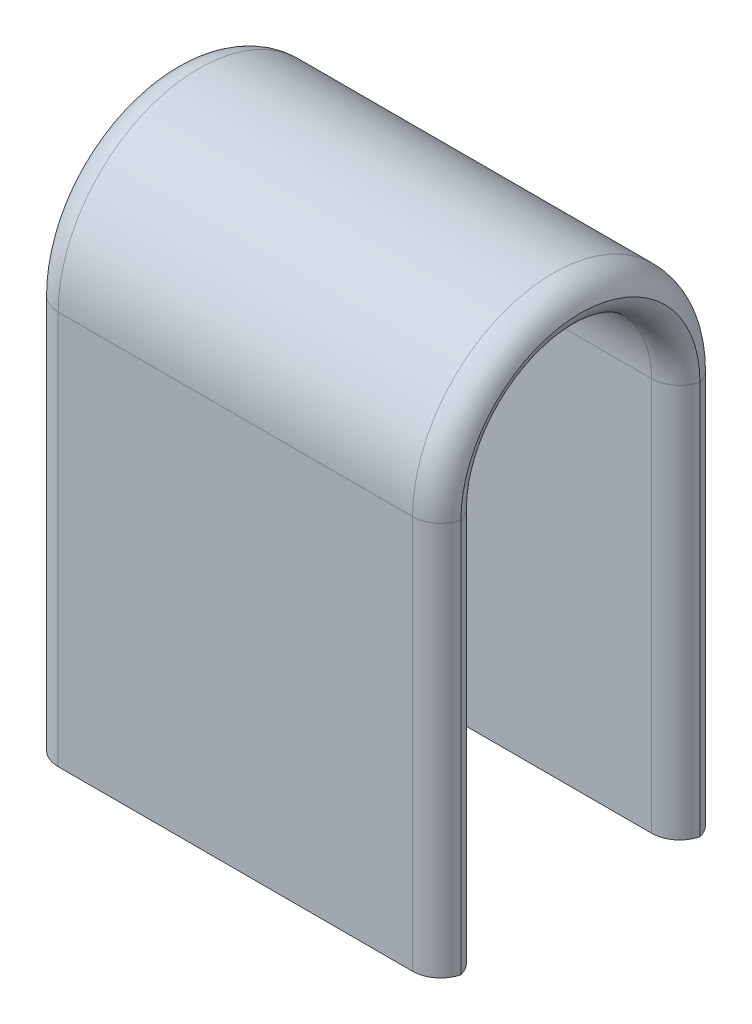
ISO-10303-21;
HEADER;
FILE_DESCRIPTION(('STEP AP214'),'2;1');
FILE_NAME('part.step','',(''),(''),'','','');
FILE_SCHEMA(('AUTOMOTIVE_DESIGN { 1 0 10303 214 1 1 1 1 }'));
ENDSEC;
DATA;
#1=APPLICATION_CONTEXT('core data for automotive mechanical design processes');
#2=APPLICATION_PROTOCOL_DEFINITION('international standard','automotive_design',2000,#1);
#3=PRODUCT_CONTEXT('',#1,'mechanical');
#4=PRODUCT('Part','Part','',(#3));
#5=PRODUCT_RELATED_PRODUCT_CATEGORY('part','',(#4));
#6=PRODUCT_DEFINITION_FORMATION('','',#4);
#7=PRODUCT_DEFINITION_CONTEXT('part definition',#1,'design');
#8=PRODUCT_DEFINITION('design','',#6,#7);
#9=PRODUCT_DEFINITION_SHAPE('','',#8);
#10=(LENGTH_UNIT() NAMED_UNIT(*) SI_UNIT(.MILLI.,.METRE.));
#11=(NAMED_UNIT(*) PLANE_ANGLE_UNIT() SI_UNIT($,.RADIAN.));
#12=(NAMED_UNIT(*) SI_UNIT($,.STERADIAN.) SOLID_ANGLE_UNIT());
#13=UNCERTAINTY_MEASURE_WITH_UNIT(LENGTH_MEASURE(1.E-05),#10,'distance_accuracy_value','');
#14=(GEOMETRIC_REPRESENTATION_CONTEXT(3) GLOBAL_UNCERTAINTY_ASSIGNED_CONTEXT((#13)) GLOBAL_UNIT_ASSIGNED_CONTEXT((#10,
#11,#12)) REPRESENTATION_CONTEXT('',''));
#15=CARTESIAN_POINT('',(0.,0.,0.));
#16=DIRECTION('',(0.,0.,1.));
#17=DIRECTION('',(1.,0.,0.));
#18=AXIS2_PLACEMENT_3D('',#15,#16,#17);
#19=CARTESIAN_POINT('',(-9.271,-8.89,-1.905));
#20=DIRECTION('',(0.,-1.,0.));
#21=DIRECTION('',(0.,0.,-1.));
#22=AXIS2_PLACEMENT_3D('',#19,#20,#21);
#23=PLANE('',#22);
#24=CARTESIAN_POINT('',(-8.001,-8.89,-1.27));
#25=DIRECTION('',(0.,-1.,0.));
#26=DIRECTION('',(0.,0.,-1.));
#27=AXIS2_PLACEMENT_3D('',#24,#25,#26);
#28=CIRCLE('',#27,1.27);
#29=CARTESIAN_POINT('',(-8.001,-8.89,0.));
#30=VERTEX_POINT('',#29);
#31=CARTESIAN_POINT('',(-9.23067221242085,-8.89,-0.9525));
#32=VERTEX_POINT('',#31);
#33=EDGE_CURVE('E52',#30,#32,#28,.T.);
#34=ORIENTED_EDGE('',*,*,#33,.T.);
#35=CARTESIAN_POINT('',(-8.001,-8.89,-0.635));
#36=DIRECTION('',(0.,-1.,0.));
#37=DIRECTION('',(0.,0.,-1.));
#38=AXIS2_PLACEMENT_3D('',#35,#36,#37);
#39=CIRCLE('',#38,1.27);
#40=CARTESIAN_POINT('',(-8.001,-8.89,-1.905));
#41=VERTEX_POINT('',#40);
#42=EDGE_CURVE('E165',#32,#41,#39,.T.);
#43=ORIENTED_EDGE('',*,*,#42,.T.);
#44=DIRECTION('',(1.,0.,0.));
#45=VECTOR('',#44,1.);
#46=CARTESIAN_POINT('',(-9.271,-8.89,-1.905));
#47=LINE('',#46,#45);
#48=CARTESIAN_POINT('',(8.001,-8.89,-1.905));
#49=VERTEX_POINT('',#48);
#50=EDGE_CURVE('E160',#41,#49,#47,.T.);
#51=ORIENTED_EDGE('',*,*,#50,.T.);
#52=CARTESIAN_POINT('',(8.001,-8.89,-0.635));
#53=DIRECTION('',(0.,-1.,0.));
#54=DIRECTION('',(0.,0.,-1.));
#55=AXIS2_PLACEMENT_3D('',#52,#53,#54);
#56=CIRCLE('',#55,1.27);
#57=CARTESIAN_POINT('',(9.23067221242086,-8.89,-0.9525));
#58=VERTEX_POINT('',#57);
#59=EDGE_CURVE('E167',#49,#58,#56,.T.);
#60=ORIENTED_EDGE('',*,*,#59,.T.);
#61=CARTESIAN_POINT('',(8.001,-8.89,-1.27));
#62=DIRECTION('',(0.,-1.,0.));
#63=DIRECTION('',(0.,0.,-1.));
#64=AXIS2_PLACEMENT_3D('',#61,#62,#63);
#65=CIRCLE('',#64,1.27);
#66=CARTESIAN_POINT('',(8.001,-8.89,0.));
#67=VERTEX_POINT('',#66);
#68=EDGE_CURVE('E84',#58,#67,#65,.T.);
#69=ORIENTED_EDGE('',*,*,#68,.T.);
#70=DIRECTION('',(1.,0.,0.));
#71=VECTOR('',#70,1.);
#72=CARTESIAN_POINT('',(-9.271,-8.89,0.));
#73=LINE('',#72,#71);
#74=EDGE_CURVE('E220',#30,#67,#73,.T.);
#75=ORIENTED_EDGE('',*,*,#74,.F.);
#76=EDGE_LOOP('',(#34,#43,#51,#60,#69,#75));
#77=FACE_BOUND('',#76,.T.);
#78=ADVANCED_FACE('F33',(#77),#23,.T.);
#79=CARTESIAN_POINT('',(0.,0.,-1.905));
#80=DIRECTION('',(0.,0.,-1.));
#81=DIRECTION('',(-1.,0.,0.));
#82=AXIS2_PLACEMENT_3D('',#79,#80,#81);
#83=PLANE('',#82);
#84=ORIENTED_EDGE('',*,*,#50,.F.);
#85=DIRECTION('',(0.,-1.,0.));
#86=VECTOR('',#85,1.);
#87=CARTESIAN_POINT('',(-8.001,0.,-1.905));
#88=LINE('',#87,#86);
#89=CARTESIAN_POINT('',(-8.001,8.89,-1.905));
#90=VERTEX_POINT('',#89);
#91=EDGE_CURVE('E164',#41,#90,#88,.F.);
#92=ORIENTED_EDGE('',*,*,#91,.T.);
#93=DIRECTION('',(-1.,0.,0.));
#94=VECTOR('',#93,1.);
#95=CARTESIAN_POINT('',(-9.271,8.89,-1.905));
#96=LINE('',#95,#94);
#97=CARTESIAN_POINT('',(8.001,8.89,-1.905));
#98=VERTEX_POINT('',#97);
#99=EDGE_CURVE('E163',#98,#90,#96,.T.);
#100=ORIENTED_EDGE('',*,*,#99,.F.);
#101=DIRECTION('',(0.,1.,0.));
#102=VECTOR('',#101,1.);
#103=CARTESIAN_POINT('',(8.001,0.,-1.905));
#104=LINE('',#103,#102);
#105=EDGE_CURVE('E103',#98,#49,#104,.F.);
#106=ORIENTED_EDGE('',*,*,#105,.T.);
#107=EDGE_LOOP('',(#84,#92,#100,#106));
#108=FACE_BOUND('',#107,.T.);
#109=ADVANCED_FACE('F158',(#108),#83,.T.);
#110=CARTESIAN_POINT('',(0.,0.,0.));
#111=DIRECTION('',(0.,0.,-1.));
#112=DIRECTION('',(-1.,0.,0.));
#113=AXIS2_PLACEMENT_3D('',#110,#111,#112);
#114=PLANE('',#113);
#115=DIRECTION('',(-1.,0.,0.));
#116=VECTOR('',#115,1.);
#117=CARTESIAN_POINT('',(-9.271,8.89,0.));
#118=LINE('',#117,#116);
#119=CARTESIAN_POINT('',(8.001,8.89,0.));
#120=VERTEX_POINT('',#119);
#121=CARTESIAN_POINT('',(-8.001,8.89,0.));
#122=VERTEX_POINT('',#121);
#123=EDGE_CURVE('E218',#120,#122,#118,.T.);
#124=ORIENTED_EDGE('',*,*,#123,.T.);
#125=DIRECTION('',(0.,-1.,0.));
#126=VECTOR('',#125,1.);
#127=CARTESIAN_POINT('',(-8.001,-8.89,0.));
#128=LINE('',#127,#126);
#129=EDGE_CURVE('E11',#122,#30,#128,.T.);
#130=ORIENTED_EDGE('',*,*,#129,.T.);
#131=ORIENTED_EDGE('',*,*,#74,.T.);
#132=DIRECTION('',(0.,1.,0.));
#133=VECTOR('',#132,1.);
#134=CARTESIAN_POINT('',(8.001,8.89,0.));
#135=LINE('',#134,#133);
#136=EDGE_CURVE('E43',#67,#120,#135,.T.);
#137=ORIENTED_EDGE('',*,*,#136,.T.);
#138=EDGE_LOOP('',(#124,#130,#131,#137));
#139=FACE_BOUND('',#138,.T.);
#140=ADVANCED_FACE('F269',(#139),#114,.F.);
#141=CARTESIAN_POINT('',(23.4700316571237,8.89,-6.35));
#142=DIRECTION('',(-1.,0.,0.));
#143=DIRECTION('',(0.,0.,1.));
#144=AXIS2_PLACEMENT_3D('',#141,#142,#143);
#145=CYLINDRICAL_SURFACE('',#144,6.35);
#146=DIRECTION('',(-1.,0.,0.));
#147=VECTOR('',#146,1.);
#148=CARTESIAN_POINT('',(23.4700316571237,8.89,-12.7));
#149=LINE('',#148,#147);
#150=CARTESIAN_POINT('',(8.001,8.89,-12.7));
#151=VERTEX_POINT('',#150);
#152=CARTESIAN_POINT('',(-8.001,8.89,-12.7));
#153=VERTEX_POINT('',#152);
#154=EDGE_CURVE('E212',#151,#153,#149,.T.);
#155=ORIENTED_EDGE('',*,*,#154,.T.);
#156=CARTESIAN_POINT('',(-8.001,8.89,-6.35));
#157=DIRECTION('',(-1.,0.,0.));
#158=DIRECTION('',(0.,0.,1.));
#159=AXIS2_PLACEMENT_3D('',#156,#157,#158);
#160=CIRCLE('',#159,6.35);
#161=EDGE_CURVE('E231',#153,#122,#160,.F.);
#162=ORIENTED_EDGE('',*,*,#161,.T.);
#163=ORIENTED_EDGE('',*,*,#123,.F.);
#164=CARTESIAN_POINT('',(8.001,8.89,-6.35));
#165=DIRECTION('',(1.,0.,0.));
#166=DIRECTION('',(0.,0.,-1.));
#167=AXIS2_PLACEMENT_3D('',#164,#165,#166);
#168=CIRCLE('',#167,6.35);
#169=EDGE_CURVE('E96',#120,#151,#168,.F.);
#170=ORIENTED_EDGE('',*,*,#169,.T.);
#171=EDGE_LOOP('',(#155,#162,#163,#170));
#172=FACE_BOUND('',#171,.T.);
#173=ADVANCED_FACE('F271',(#172),#145,.T.);
#174=CARTESIAN_POINT('',(23.4700316571237,8.89,-6.35));
#175=DIRECTION('',(-1.,0.,0.));
#176=DIRECTION('',(0.,0.,1.));
#177=AXIS2_PLACEMENT_3D('',#174,#175,#176);
#178=CYLINDRICAL_SURFACE('',#177,4.445);
#179=ORIENTED_EDGE('',*,*,#99,.T.);
#180=CARTESIAN_POINT('',(-8.001,8.89,-6.35));
#181=DIRECTION('',(-1.,0.,0.));
#182=DIRECTION('',(0.,0.,1.));
#183=AXIS2_PLACEMENT_3D('',#180,#181,#182);
#184=CIRCLE('',#183,4.445);
#185=CARTESIAN_POINT('',(-8.001,8.89,-10.795));
#186=VERTEX_POINT('',#185);
#187=EDGE_CURVE('E227',#90,#186,#184,.T.);
#188=ORIENTED_EDGE('',*,*,#187,.T.);
#189=DIRECTION('',(-1.,0.,0.));
#190=VECTOR('',#189,1.);
#191=CARTESIAN_POINT('',(23.4700316571237,8.89,-10.795));
#192=LINE('',#191,#190);
#193=CARTESIAN_POINT('',(8.001,8.89,-10.795));
#194=VERTEX_POINT('',#193);
#195=EDGE_CURVE('E215',#194,#186,#192,.T.);
#196=ORIENTED_EDGE('',*,*,#195,.F.);
#197=CARTESIAN_POINT('',(8.001,8.89,-6.35));
#198=DIRECTION('',(1.,0.,0.));
#199=DIRECTION('',(0.,0.,-1.));
#200=AXIS2_PLACEMENT_3D('',#197,#198,#199);
#201=CIRCLE('',#200,4.445);
#202=EDGE_CURVE('E169',#194,#98,#201,.T.);
#203=ORIENTED_EDGE('',*,*,#202,.T.);
#204=EDGE_LOOP('',(#179,#188,#196,#203));
#205=FACE_BOUND('',#204,.T.);
#206=ADVANCED_FACE('F255',(#205),#178,.F.);
#207=CARTESIAN_POINT('',(9.271,-8.89,-10.795));
#208=DIRECTION('',(0.,1.,0.));
#209=DIRECTION('',(0.,0.,1.));
#210=AXIS2_PLACEMENT_3D('',#207,#208,#209);
#211=PLANE('',#210);
#212=CARTESIAN_POINT('',(-8.001,-8.89,-12.065));
#213=DIRECTION('',(0.,1.,0.));
#214=DIRECTION('',(0.,0.,1.));
#215=AXIS2_PLACEMENT_3D('',#212,#213,#214);
#216=CIRCLE('',#215,1.27);
#217=CARTESIAN_POINT('',(-8.001,-8.89,-10.795));
#218=VERTEX_POINT('',#217);
#219=CARTESIAN_POINT('',(-9.23067221242085,-8.89,-11.7475));
#220=VERTEX_POINT('',#219);
#221=EDGE_CURVE('E237',#218,#220,#216,.F.);
#222=ORIENTED_EDGE('',*,*,#221,.T.);
#223=CARTESIAN_POINT('',(-8.001,-8.89,-11.43));
#224=DIRECTION('',(0.,1.,0.));
#225=DIRECTION('',(0.,0.,1.));
#226=AXIS2_PLACEMENT_3D('',#223,#224,#225);
#227=CIRCLE('',#226,1.27);
#228=CARTESIAN_POINT('',(-8.001,-8.89,-12.7));
#229=VERTEX_POINT('',#228);
#230=EDGE_CURVE('E239',#220,#229,#227,.F.);
#231=ORIENTED_EDGE('',*,*,#230,.T.);
#232=DIRECTION('',(1.,0.,0.));
#233=VECTOR('',#232,1.);
#234=CARTESIAN_POINT('',(9.271,-8.89,-12.7));
#235=LINE('',#234,#233);
#236=CARTESIAN_POINT('',(8.001,-8.89,-12.7));
#237=VERTEX_POINT('',#236);
#238=EDGE_CURVE('E201',#229,#237,#235,.T.);
#239=ORIENTED_EDGE('',*,*,#238,.T.);
#240=CARTESIAN_POINT('',(8.001,-8.89,-11.43));
#241=DIRECTION('',(0.,1.,0.));
#242=DIRECTION('',(0.,0.,1.));
#243=AXIS2_PLACEMENT_3D('',#240,#241,#242);
#244=CIRCLE('',#243,1.27);
#245=CARTESIAN_POINT('',(9.23067221242086,-8.89,-11.7475));
#246=VERTEX_POINT('',#245);
#247=EDGE_CURVE('E233',#237,#246,#244,.F.);
#248=ORIENTED_EDGE('',*,*,#247,.T.);
#249=CARTESIAN_POINT('',(8.001,-8.89,-12.065));
#250=DIRECTION('',(0.,1.,0.));
#251=DIRECTION('',(0.,0.,1.));
#252=AXIS2_PLACEMENT_3D('',#249,#250,#251);
#253=CIRCLE('',#252,1.27);
#254=CARTESIAN_POINT('',(8.001,-8.89,-10.795));
#255=VERTEX_POINT('',#254);
#256=EDGE_CURVE('E235',#246,#255,#253,.F.);
#257=ORIENTED_EDGE('',*,*,#256,.T.);
#258=DIRECTION('',(1.,0.,0.));
#259=VECTOR('',#258,1.);
#260=CARTESIAN_POINT('',(9.271,-8.89,-10.795));
#261=LINE('',#260,#259);
#262=EDGE_CURVE('E206',#218,#255,#261,.T.);
#263=ORIENTED_EDGE('',*,*,#262,.F.);
#264=EDGE_LOOP('',(#222,#231,#239,#248,#257,#263));
#265=FACE_BOUND('',#264,.T.);
#266=ADVANCED_FACE('F259',(#265),#211,.F.);
#267=CARTESIAN_POINT('',(0.,0.,-10.795));
#268=DIRECTION('',(0.,0.,1.));
#269=DIRECTION('',(1.,0.,0.));
#270=AXIS2_PLACEMENT_3D('',#267,#268,#269);
#271=PLANE('',#270);
#272=ORIENTED_EDGE('',*,*,#195,.T.);
#273=DIRECTION('',(0.,-1.,0.));
#274=VECTOR('',#273,1.);
#275=CARTESIAN_POINT('',(-8.001,0.,-10.795));
#276=LINE('',#275,#274);
#277=EDGE_CURVE('E171',#186,#218,#276,.T.);
#278=ORIENTED_EDGE('',*,*,#277,.T.);
#279=ORIENTED_EDGE('',*,*,#262,.T.);
#280=DIRECTION('',(0.,1.,0.));
#281=VECTOR('',#280,1.);
#282=CARTESIAN_POINT('',(8.001,0.,-10.795));
#283=LINE('',#282,#281);
#284=EDGE_CURVE('E174',#255,#194,#283,.T.);
#285=ORIENTED_EDGE('',*,*,#284,.T.);
#286=EDGE_LOOP('',(#272,#278,#279,#285));
#287=FACE_BOUND('',#286,.T.);
#288=ADVANCED_FACE('F248',(#287),#271,.T.);
#289=CARTESIAN_POINT('',(0.,0.,-12.7));
#290=DIRECTION('',(0.,0.,1.));
#291=DIRECTION('',(1.,0.,0.));
#292=AXIS2_PLACEMENT_3D('',#289,#290,#291);
#293=PLANE('',#292);
#294=ORIENTED_EDGE('',*,*,#238,.F.);
#295=DIRECTION('',(0.,-1.,0.));
#296=VECTOR('',#295,1.);
#297=CARTESIAN_POINT('',(-8.001,8.89,-12.7));
#298=LINE('',#297,#296);
#299=EDGE_CURVE('E243',#229,#153,#298,.F.);
#300=ORIENTED_EDGE('',*,*,#299,.T.);
#301=ORIENTED_EDGE('',*,*,#154,.F.);
#302=DIRECTION('',(0.,1.,0.));
#303=VECTOR('',#302,1.);
#304=CARTESIAN_POINT('',(8.001,-8.89,-12.7));
#305=LINE('',#304,#303);
#306=EDGE_CURVE('E241',#151,#237,#305,.F.);
#307=ORIENTED_EDGE('',*,*,#306,.T.);
#308=EDGE_LOOP('',(#294,#300,#301,#307));
#309=FACE_BOUND('',#308,.T.);
#310=ADVANCED_FACE('F305',(#309),#293,.F.);
#311=CARTESIAN_POINT('',(-8.001,-8.89,-11.43));
#312=DIRECTION('',(0.,1.,0.));
#313=DIRECTION('',(0.,0.,1.));
#314=AXIS2_PLACEMENT_3D('',#311,#312,#313);
#315=CYLINDRICAL_SURFACE('',#314,1.27);
#316=ORIENTED_EDGE('',*,*,#299,.F.);
#317=ORIENTED_EDGE('',*,*,#230,.F.);
#318=DIRECTION('',(0.,-1.,0.));
#319=VECTOR('',#318,1.);
#320=CARTESIAN_POINT('',(-9.23067221242085,0.,-11.7475));
#321=LINE('',#320,#319);
#322=CARTESIAN_POINT('',(-9.23067221242088,8.89,-11.7475000000001));
#323=VERTEX_POINT('',#322);
#324=EDGE_CURVE('E199',#323,#220,#321,.T.);
#325=ORIENTED_EDGE('',*,*,#324,.F.);
#326=CARTESIAN_POINT('',(-8.001,8.89,-11.43));
#327=DIRECTION('',(0.,1.,0.));
#328=DIRECTION('',(0.,0.,1.));
#329=AXIS2_PLACEMENT_3D('',#326,#327,#328);
#330=CIRCLE('',#329,1.27);
#331=EDGE_CURVE('E197',#153,#323,#330,.T.);
#332=ORIENTED_EDGE('',*,*,#331,.F.);
#333=EDGE_LOOP('',(#316,#317,#325,#332));
#334=FACE_BOUND('',#333,.T.);
#335=ADVANCED_FACE('F308',(#334),#315,.T.);
#336=CARTESIAN_POINT('',(-8.001,0.,-1.27));
#337=DIRECTION('',(0.,1.,0.));
#338=DIRECTION('',(0.,0.,1.));
#339=AXIS2_PLACEMENT_3D('',#336,#337,#338);
#340=CYLINDRICAL_SURFACE('',#339,1.27);
#341=ORIENTED_EDGE('',*,*,#33,.F.);
#342=ORIENTED_EDGE('',*,*,#129,.F.);
#343=CARTESIAN_POINT('',(-8.001,8.89,-1.27));
#344=DIRECTION('',(0.,1.,0.));
#345=DIRECTION('',(0.,0.,1.));
#346=AXIS2_PLACEMENT_3D('',#343,#344,#345);
#347=CIRCLE('',#346,1.27);
#348=CARTESIAN_POINT('',(-9.23067221242104,8.89,-0.952499999999281));
#349=VERTEX_POINT('',#348);
#350=EDGE_CURVE('E194',#349,#122,#347,.T.);
#351=ORIENTED_EDGE('',*,*,#350,.F.);
#352=DIRECTION('',(0.,-1.,0.));
#353=VECTOR('',#352,1.);
#354=CARTESIAN_POINT('',(-9.23067221242085,0.,-0.9525));
#355=LINE('',#354,#353);
#356=EDGE_CURVE('E191',#32,#349,#355,.F.);
#357=ORIENTED_EDGE('',*,*,#356,.F.);
#358=EDGE_LOOP('',(#341,#342,#351,#357));
#359=FACE_BOUND('',#358,.T.);
#360=ADVANCED_FACE('F278',(#359),#340,.T.);
#361=CARTESIAN_POINT('',(-8.001,0.,-12.065));
#362=DIRECTION('',(0.,-1.,0.));
#363=DIRECTION('',(0.,0.,-1.));
#364=AXIS2_PLACEMENT_3D('',#361,#362,#363);
#365=CYLINDRICAL_SURFACE('',#364,1.27);
#366=ORIENTED_EDGE('',*,*,#221,.F.);
#367=ORIENTED_EDGE('',*,*,#277,.F.);
#368=CARTESIAN_POINT('',(-8.001,8.89,-12.065));
#369=DIRECTION('',(0.,1.,0.));
#370=DIRECTION('',(0.,0.,1.));
#371=AXIS2_PLACEMENT_3D('',#368,#369,#370);
#372=CIRCLE('',#371,1.27);
#373=EDGE_CURVE('E188',#323,#186,#372,.T.);
#374=ORIENTED_EDGE('',*,*,#373,.F.);
#375=ORIENTED_EDGE('',*,*,#324,.T.);
#376=EDGE_LOOP('',(#366,#367,#374,#375));
#377=FACE_BOUND('',#376,.T.);
#378=ADVANCED_FACE('F262',(#377),#365,.T.);
#379=CARTESIAN_POINT('',(-8.001,8.89,-6.35));
#380=DIRECTION('',(-1.,0.,0.));
#381=DIRECTION('',(0.,0.,1.));
#382=AXIS2_PLACEMENT_3D('',#379,#380,#381);
#383=TOROIDAL_SURFACE('',#382,5.08,1.27);
#384=ORIENTED_EDGE('',*,*,#161,.F.);
#385=ORIENTED_EDGE('',*,*,#331,.T.);
#386=CARTESIAN_POINT('',(-9.23067221242085,8.89,-6.35));
#387=DIRECTION('',(1.,0.,0.));
#388=DIRECTION('',(0.,0.,-1.));
#389=AXIS2_PLACEMENT_3D('',#386,#387,#388);
#390=CIRCLE('',#389,5.3975);
#391=EDGE_CURVE('E185',#349,#323,#390,.F.);
#392=ORIENTED_EDGE('',*,*,#391,.F.);
#393=ORIENTED_EDGE('',*,*,#350,.T.);
#394=EDGE_LOOP('',(#384,#385,#392,#393));
#395=FACE_BOUND('',#394,.T.);
#396=ADVANCED_FACE('F275',(#395),#383,.T.);
#397=CARTESIAN_POINT('',(-8.001,-8.89,-0.635));
#398=DIRECTION('',(0.,-1.,0.));
#399=DIRECTION('',(0.,0.,-1.));
#400=AXIS2_PLACEMENT_3D('',#397,#398,#399);
#401=CYLINDRICAL_SURFACE('',#400,1.27);
#402=ORIENTED_EDGE('',*,*,#42,.F.);
#403=ORIENTED_EDGE('',*,*,#356,.T.);
#404=CARTESIAN_POINT('',(-8.001,8.89,-0.635));
#405=DIRECTION('',(0.,1.,0.));
#406=DIRECTION('',(0.,0.,1.));
#407=AXIS2_PLACEMENT_3D('',#404,#405,#406);
#408=CIRCLE('',#407,1.27);
#409=EDGE_CURVE('E88',#90,#349,#408,.T.);
#410=ORIENTED_EDGE('',*,*,#409,.F.);
#411=ORIENTED_EDGE('',*,*,#91,.F.);
#412=EDGE_LOOP('',(#402,#403,#410,#411));
#413=FACE_BOUND('',#412,.T.);
#414=ADVANCED_FACE('F281',(#413),#401,.T.);
#415=CARTESIAN_POINT('',(-8.001,8.89,-6.35));
#416=DIRECTION('',(-1.,0.,0.));
#417=DIRECTION('',(0.,0.,1.));
#418=AXIS2_PLACEMENT_3D('',#415,#416,#417);
#419=TOROIDAL_SURFACE('',#418,5.715,1.27);
#420=ORIENTED_EDGE('',*,*,#373,.T.);
#421=ORIENTED_EDGE('',*,*,#187,.F.);
#422=ORIENTED_EDGE('',*,*,#409,.T.);
#423=ORIENTED_EDGE('',*,*,#391,.T.);
#424=EDGE_LOOP('',(#420,#421,#422,#423));
#425=FACE_BOUND('',#424,.T.);
#426=ADVANCED_FACE('F282',(#425),#419,.T.);
#427=CARTESIAN_POINT('',(8.001,0.,-1.27));
#428=DIRECTION('',(0.,-1.,0.));
#429=DIRECTION('',(0.,0.,-1.));
#430=AXIS2_PLACEMENT_3D('',#427,#428,#429);
#431=CYLINDRICAL_SURFACE('',#430,1.27);
#432=ORIENTED_EDGE('',*,*,#136,.F.);
#433=ORIENTED_EDGE('',*,*,#68,.F.);
#434=DIRECTION('',(0.,1.,0.));
#435=VECTOR('',#434,1.);
#436=CARTESIAN_POINT('',(9.23067221242086,0.,-0.9525));
#437=LINE('',#436,#435);
#438=CARTESIAN_POINT('',(9.23067221242089,8.89,-0.952499999999871));
#439=VERTEX_POINT('',#438);
#440=EDGE_CURVE('E37',#439,#58,#437,.F.);
#441=ORIENTED_EDGE('',*,*,#440,.F.);
#442=CARTESIAN_POINT('',(8.001,8.89,-1.27));
#443=DIRECTION('',(0.,1.,0.));
#444=DIRECTION('',(0.,0.,1.));
#445=AXIS2_PLACEMENT_3D('',#442,#443,#444);
#446=CIRCLE('',#445,1.27);
#447=EDGE_CURVE('E81',#120,#439,#446,.T.);
#448=ORIENTED_EDGE('',*,*,#447,.F.);
#449=EDGE_LOOP('',(#432,#433,#441,#448));
#450=FACE_BOUND('',#449,.T.);
#451=ADVANCED_FACE('F35',(#450),#431,.T.);
#452=CARTESIAN_POINT('',(8.001,-8.89,-11.43));
#453=DIRECTION('',(0.,-1.,0.));
#454=DIRECTION('',(0.,0.,-1.));
#455=AXIS2_PLACEMENT_3D('',#452,#453,#454);
#456=CYLINDRICAL_SURFACE('',#455,1.27);
#457=ORIENTED_EDGE('',*,*,#247,.F.);
#458=ORIENTED_EDGE('',*,*,#306,.F.);
#459=CARTESIAN_POINT('',(8.001,8.89,-11.43));
#460=DIRECTION('',(0.,1.,0.));
#461=DIRECTION('',(0.,0.,1.));
#462=AXIS2_PLACEMENT_3D('',#459,#460,#461);
#463=CIRCLE('',#462,1.27);
#464=CARTESIAN_POINT('',(9.23067221242104,8.89,-11.7475000000007));
#465=VERTEX_POINT('',#464);
#466=EDGE_CURVE('E71',#465,#151,#463,.T.);
#467=ORIENTED_EDGE('',*,*,#466,.F.);
#468=DIRECTION('',(0.,1.,0.));
#469=VECTOR('',#468,1.);
#470=CARTESIAN_POINT('',(9.23067221242086,0.,-11.7475));
#471=LINE('',#470,#469);
#472=EDGE_CURVE('E107',#246,#465,#471,.T.);
#473=ORIENTED_EDGE('',*,*,#472,.F.);
#474=EDGE_LOOP('',(#457,#458,#467,#473));
#475=FACE_BOUND('',#474,.T.);
#476=ADVANCED_FACE('F258',(#475),#456,.T.);
#477=CARTESIAN_POINT('',(8.001,-8.89,-0.635));
#478=DIRECTION('',(0.,1.,0.));
#479=DIRECTION('',(0.,0.,1.));
#480=AXIS2_PLACEMENT_3D('',#477,#478,#479);
#481=CYLINDRICAL_SURFACE('',#480,1.27);
#482=ORIENTED_EDGE('',*,*,#59,.F.);
#483=ORIENTED_EDGE('',*,*,#105,.F.);
#484=CARTESIAN_POINT('',(8.001,8.89,-0.635));
#485=DIRECTION('',(0.,1.,0.));
#486=DIRECTION('',(0.,0.,1.));
#487=AXIS2_PLACEMENT_3D('',#484,#485,#486);
#488=CIRCLE('',#487,1.27);
#489=EDGE_CURVE('E99',#439,#98,#488,.T.);
#490=ORIENTED_EDGE('',*,*,#489,.F.);
#491=ORIENTED_EDGE('',*,*,#440,.T.);
#492=EDGE_LOOP('',(#482,#483,#490,#491));
#493=FACE_BOUND('',#492,.T.);
#494=ADVANCED_FACE('F100',(#493),#481,.T.);
#495=CARTESIAN_POINT('',(8.001,8.89,-6.35));
#496=DIRECTION('',(1.,0.,0.));
#497=DIRECTION('',(0.,0.,-1.));
#498=AXIS2_PLACEMENT_3D('',#495,#496,#497);
#499=TOROIDAL_SURFACE('',#498,5.08,1.27);
#500=ORIENTED_EDGE('',*,*,#169,.F.);
#501=ORIENTED_EDGE('',*,*,#447,.T.);
#502=CARTESIAN_POINT('',(9.23067221242086,8.89,-6.35));
#503=DIRECTION('',(-1.,0.,0.));
#504=DIRECTION('',(0.,0.,1.));
#505=AXIS2_PLACEMENT_3D('',#502,#503,#504);
#506=CIRCLE('',#505,5.3975);
#507=EDGE_CURVE('E93',#465,#439,#506,.F.);
#508=ORIENTED_EDGE('',*,*,#507,.F.);
#509=ORIENTED_EDGE('',*,*,#466,.T.);
#510=EDGE_LOOP('',(#500,#501,#508,#509));
#511=FACE_BOUND('',#510,.T.);
#512=ADVANCED_FACE('F91',(#511),#499,.T.);
#513=CARTESIAN_POINT('',(8.001,0.,-12.065));
#514=DIRECTION('',(0.,1.,0.));
#515=DIRECTION('',(0.,0.,1.));
#516=AXIS2_PLACEMENT_3D('',#513,#514,#515);
#517=CYLINDRICAL_SURFACE('',#516,1.27);
#518=ORIENTED_EDGE('',*,*,#256,.F.);
#519=ORIENTED_EDGE('',*,*,#472,.T.);
#520=CARTESIAN_POINT('',(8.001,8.89,-12.065));
#521=DIRECTION('',(0.,1.,0.));
#522=DIRECTION('',(0.,0.,1.));
#523=AXIS2_PLACEMENT_3D('',#520,#521,#522);
#524=CIRCLE('',#523,1.27);
#525=EDGE_CURVE('E111',#194,#465,#524,.T.);
#526=ORIENTED_EDGE('',*,*,#525,.F.);
#527=ORIENTED_EDGE('',*,*,#284,.F.);
#528=EDGE_LOOP('',(#518,#519,#526,#527));
#529=FACE_BOUND('',#528,.T.);
#530=ADVANCED_FACE('F257',(#529),#517,.T.);
#531=CARTESIAN_POINT('',(8.001,8.89,-6.35));
#532=DIRECTION('',(1.,0.,0.));
#533=DIRECTION('',(0.,0.,-1.));
#534=AXIS2_PLACEMENT_3D('',#531,#532,#533);
#535=TOROIDAL_SURFACE('',#534,5.715,1.27);
#536=ORIENTED_EDGE('',*,*,#507,.T.);
#537=ORIENTED_EDGE('',*,*,#489,.T.);
#538=ORIENTED_EDGE('',*,*,#202,.F.);
#539=ORIENTED_EDGE('',*,*,#525,.T.);
#540=EDGE_LOOP('',(#536,#537,#538,#539));
#541=FACE_BOUND('',#540,.T.);
#542=ADVANCED_FACE('F109',(#541),#535,.T.);
#543=CLOSED_SHELL('',(#78,#109,#140,#173,#206,#266,#288,#310,#335,#360,#378,#396,#414,#426,#451,
#476,#494,#512,#530,#542));
#544=MANIFOLD_SOLID_BREP('B2',#543);
#545=ADVANCED_BREP_SHAPE_REPRESENTATION('',(#18,#544),#14);
#546=SHAPE_DEFINITION_REPRESENTATION(#9,#545);
ENDSEC;
END-ISO-10303-21;
